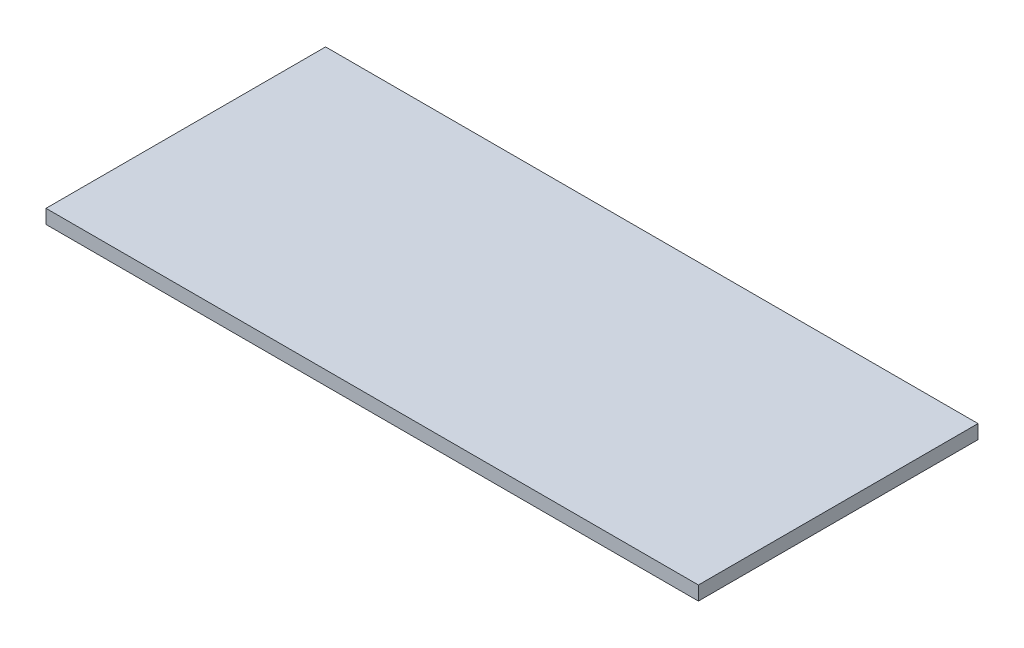
ISO-10303-21;
HEADER;
FILE_DESCRIPTION(('STEP AP214'),'2;1');
FILE_NAME('part.step','',(''),(''),'','','');
FILE_SCHEMA(('AUTOMOTIVE_DESIGN { 1 0 10303 214 1 1 1 1 }'));
ENDSEC;
DATA;
#1=APPLICATION_CONTEXT('core data for automotive mechanical design processes');
#2=APPLICATION_PROTOCOL_DEFINITION('international standard','automotive_design',2000,#1);
#3=PRODUCT_CONTEXT('',#1,'mechanical');
#4=PRODUCT('Part','Part','',(#3));
#5=PRODUCT_RELATED_PRODUCT_CATEGORY('part','',(#4));
#6=PRODUCT_DEFINITION_FORMATION('','',#4);
#7=PRODUCT_DEFINITION_CONTEXT('part definition',#1,'design');
#8=PRODUCT_DEFINITION('design','',#6,#7);
#9=PRODUCT_DEFINITION_SHAPE('','',#8);
#10=(LENGTH_UNIT() NAMED_UNIT(*) SI_UNIT(.MILLI.,.METRE.));
#11=(NAMED_UNIT(*) PLANE_ANGLE_UNIT() SI_UNIT($,.RADIAN.));
#12=(NAMED_UNIT(*) SI_UNIT($,.STERADIAN.) SOLID_ANGLE_UNIT());
#13=UNCERTAINTY_MEASURE_WITH_UNIT(LENGTH_MEASURE(1.E-05),#10,'distance_accuracy_value','');
#14=(GEOMETRIC_REPRESENTATION_CONTEXT(3) GLOBAL_UNCERTAINTY_ASSIGNED_CONTEXT((#13)) GLOBAL_UNIT_ASSIGNED_CONTEXT((#10,
#11,#12)) REPRESENTATION_CONTEXT('',''));
#15=CARTESIAN_POINT('',(0.,0.,0.));
#16=DIRECTION('',(0.,0.,1.));
#17=DIRECTION('',(1.,0.,0.));
#18=AXIS2_PLACEMENT_3D('',#15,#16,#17);
#19=CARTESIAN_POINT('',(-350.,15.,150.));
#20=DIRECTION('',(1.,0.,0.));
#21=DIRECTION('',(0.,0.,-1.));
#22=AXIS2_PLACEMENT_3D('',#19,#20,#21);
#23=PLANE('',#22);
#24=DIRECTION('',(0.,0.,1.));
#25=VECTOR('',#24,1.);
#26=CARTESIAN_POINT('',(-350.,0.,150.));
#27=LINE('',#26,#25);
#28=CARTESIAN_POINT('',(-350.,0.,-150.));
#29=VERTEX_POINT('',#28);
#30=CARTESIAN_POINT('',(-350.,0.,150.));
#31=VERTEX_POINT('',#30);
#32=EDGE_CURVE('E95',#29,#31,#27,.T.);
#33=ORIENTED_EDGE('',*,*,#32,.T.);
#34=DIRECTION('',(0.,-1.,0.));
#35=VECTOR('',#34,1.);
#36=CARTESIAN_POINT('',(-350.,15.,150.));
#37=LINE('',#36,#35);
#38=CARTESIAN_POINT('',(-350.,15.,150.));
#39=VERTEX_POINT('',#38);
#40=EDGE_CURVE('E11',#39,#31,#37,.T.);
#41=ORIENTED_EDGE('',*,*,#40,.F.);
#42=DIRECTION('',(0.,0.,1.));
#43=VECTOR('',#42,1.);
#44=CARTESIAN_POINT('',(-350.,15.,150.));
#45=LINE('',#44,#43);
#46=CARTESIAN_POINT('',(-350.,15.,-150.));
#47=VERTEX_POINT('',#46);
#48=EDGE_CURVE('E83',#47,#39,#45,.T.);
#49=ORIENTED_EDGE('',*,*,#48,.F.);
#50=DIRECTION('',(0.,-1.,0.));
#51=VECTOR('',#50,1.);
#52=CARTESIAN_POINT('',(-350.,15.,-150.));
#53=LINE('',#52,#51);
#54=EDGE_CURVE('E91',#47,#29,#53,.T.);
#55=ORIENTED_EDGE('',*,*,#54,.T.);
#56=EDGE_LOOP('',(#33,#41,#49,#55));
#57=FACE_BOUND('',#56,.T.);
#58=ADVANCED_FACE('F32',(#57),#23,.F.);
#59=CARTESIAN_POINT('',(350.,15.,150.));
#60=DIRECTION('',(0.,0.,-1.));
#61=DIRECTION('',(-1.,0.,0.));
#62=AXIS2_PLACEMENT_3D('',#59,#60,#61);
#63=PLANE('',#62);
#64=DIRECTION('',(1.,0.,0.));
#65=VECTOR('',#64,1.);
#66=CARTESIAN_POINT('',(350.,0.,150.));
#67=LINE('',#66,#65);
#68=CARTESIAN_POINT('',(350.,0.,150.));
#69=VERTEX_POINT('',#68);
#70=EDGE_CURVE('E87',#31,#69,#67,.T.);
#71=ORIENTED_EDGE('',*,*,#70,.T.);
#72=DIRECTION('',(0.,-1.,0.));
#73=VECTOR('',#72,1.);
#74=CARTESIAN_POINT('',(350.,15.,150.));
#75=LINE('',#74,#73);
#76=CARTESIAN_POINT('',(350.,15.,150.));
#77=VERTEX_POINT('',#76);
#78=EDGE_CURVE('E40',#77,#69,#75,.T.);
#79=ORIENTED_EDGE('',*,*,#78,.F.);
#80=DIRECTION('',(1.,0.,0.));
#81=VECTOR('',#80,1.);
#82=CARTESIAN_POINT('',(350.,15.,150.));
#83=LINE('',#82,#81);
#84=EDGE_CURVE('E78',#39,#77,#83,.T.);
#85=ORIENTED_EDGE('',*,*,#84,.F.);
#86=ORIENTED_EDGE('',*,*,#40,.T.);
#87=EDGE_LOOP('',(#71,#79,#85,#86));
#88=FACE_BOUND('',#87,.T.);
#89=ADVANCED_FACE('F86',(#88),#63,.F.);
#90=CARTESIAN_POINT('',(350.,15.,150.));
#91=DIRECTION('',(-1.,0.,0.));
#92=DIRECTION('',(0.,0.,1.));
#93=AXIS2_PLACEMENT_3D('',#90,#91,#92);
#94=PLANE('',#93);
#95=DIRECTION('',(0.,0.,-1.));
#96=VECTOR('',#95,1.);
#97=CARTESIAN_POINT('',(350.,0.,150.));
#98=LINE('',#97,#96);
#99=CARTESIAN_POINT('',(350.,0.,-150.));
#100=VERTEX_POINT('',#99);
#101=EDGE_CURVE('E65',#69,#100,#98,.T.);
#102=ORIENTED_EDGE('',*,*,#101,.T.);
#103=DIRECTION('',(0.,-1.,0.));
#104=VECTOR('',#103,1.);
#105=CARTESIAN_POINT('',(350.,15.,-150.));
#106=LINE('',#105,#104);
#107=CARTESIAN_POINT('',(350.,15.,-150.));
#108=VERTEX_POINT('',#107);
#109=EDGE_CURVE('E88',#108,#100,#106,.T.);
#110=ORIENTED_EDGE('',*,*,#109,.F.);
#111=DIRECTION('',(0.,0.,-1.));
#112=VECTOR('',#111,1.);
#113=CARTESIAN_POINT('',(350.,15.,150.));
#114=LINE('',#113,#112);
#115=EDGE_CURVE('E81',#77,#108,#114,.T.);
#116=ORIENTED_EDGE('',*,*,#115,.F.);
#117=ORIENTED_EDGE('',*,*,#78,.T.);
#118=EDGE_LOOP('',(#102,#110,#116,#117));
#119=FACE_BOUND('',#118,.T.);
#120=ADVANCED_FACE('F89',(#119),#94,.F.);
#121=CARTESIAN_POINT('',(350.,15.,-150.));
#122=DIRECTION('',(0.,0.,1.));
#123=DIRECTION('',(1.,0.,0.));
#124=AXIS2_PLACEMENT_3D('',#121,#122,#123);
#125=PLANE('',#124);
#126=DIRECTION('',(-1.,0.,0.));
#127=VECTOR('',#126,1.);
#128=CARTESIAN_POINT('',(350.,0.,-150.));
#129=LINE('',#128,#127);
#130=EDGE_CURVE('E71',#100,#29,#129,.T.);
#131=ORIENTED_EDGE('',*,*,#130,.T.);
#132=ORIENTED_EDGE('',*,*,#54,.F.);
#133=DIRECTION('',(-1.,0.,0.));
#134=VECTOR('',#133,1.);
#135=CARTESIAN_POINT('',(350.,15.,-150.));
#136=LINE('',#135,#134);
#137=EDGE_CURVE('E48',#108,#47,#136,.T.);
#138=ORIENTED_EDGE('',*,*,#137,.F.);
#139=ORIENTED_EDGE('',*,*,#109,.T.);
#140=EDGE_LOOP('',(#131,#132,#138,#139));
#141=FACE_BOUND('',#140,.T.);
#142=ADVANCED_FACE('F102',(#141),#125,.F.);
#143=CARTESIAN_POINT('',(0.,15.,0.));
#144=DIRECTION('',(0.,1.,0.));
#145=DIRECTION('',(0.,0.,1.));
#146=AXIS2_PLACEMENT_3D('',#143,#144,#145);
#147=PLANE('',#146);
#148=ORIENTED_EDGE('',*,*,#48,.T.);
#149=ORIENTED_EDGE('',*,*,#84,.T.);
#150=ORIENTED_EDGE('',*,*,#115,.T.);
#151=ORIENTED_EDGE('',*,*,#137,.T.);
#152=EDGE_LOOP('',(#148,#149,#150,#151));
#153=FACE_BOUND('',#152,.T.);
#154=ADVANCED_FACE('F79',(#153),#147,.T.);
#155=CARTESIAN_POINT('',(0.,0.,0.));
#156=DIRECTION('',(0.,1.,0.));
#157=DIRECTION('',(0.,0.,1.));
#158=AXIS2_PLACEMENT_3D('',#155,#156,#157);
#159=PLANE('',#158);
#160=ORIENTED_EDGE('',*,*,#32,.F.);
#161=ORIENTED_EDGE('',*,*,#130,.F.);
#162=ORIENTED_EDGE('',*,*,#101,.F.);
#163=ORIENTED_EDGE('',*,*,#70,.F.);
#164=EDGE_LOOP('',(#160,#161,#162,#163));
#165=FACE_BOUND('',#164,.T.);
#166=ADVANCED_FACE('F105',(#165),#159,.F.);
#167=CLOSED_SHELL('',(#58,#89,#120,#142,#154,#166));
#168=MANIFOLD_SOLID_BREP('B2',#167);
#169=ADVANCED_BREP_SHAPE_REPRESENTATION('',(#18,#168),#14);
#170=SHAPE_DEFINITION_REPRESENTATION(#9,#169);
ENDSEC;
END-ISO-10303-21;
